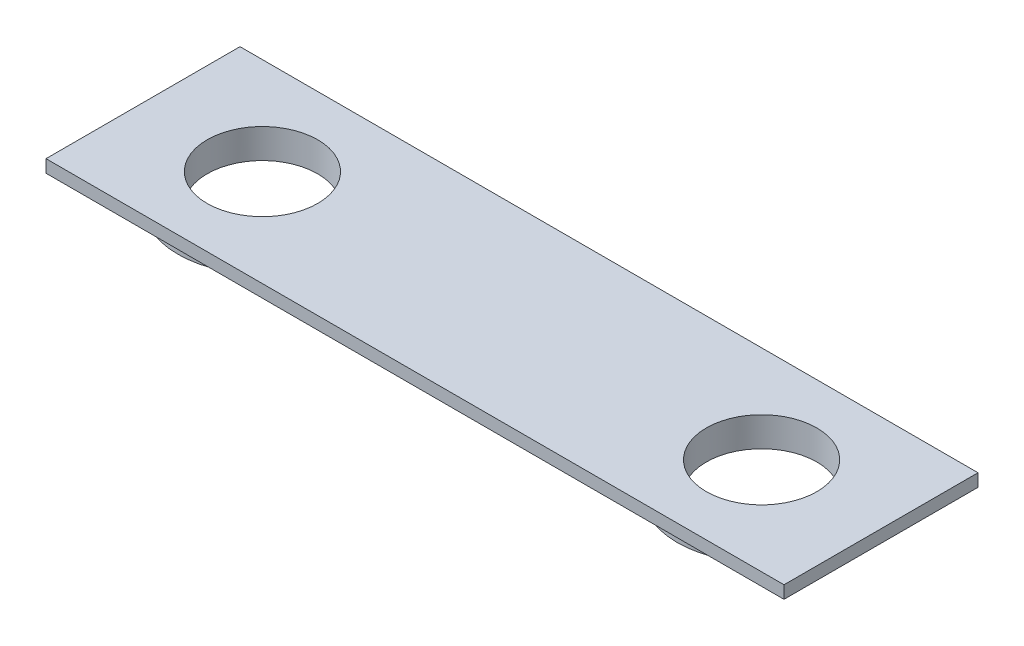
ISO-10303-21;
HEADER;
FILE_DESCRIPTION(('STEP AP214'),'2;1');
FILE_NAME('part.step','',(''),(''),'','','');
FILE_SCHEMA(('AUTOMOTIVE_DESIGN { 1 0 10303 214 1 1 1 1 }'));
ENDSEC;
DATA;
#1=APPLICATION_CONTEXT('core data for automotive mechanical design processes');
#2=APPLICATION_PROTOCOL_DEFINITION('international standard','automotive_design',2000,#1);
#3=PRODUCT_CONTEXT('',#1,'mechanical');
#4=PRODUCT('Part','Part','',(#3));
#5=PRODUCT_RELATED_PRODUCT_CATEGORY('part','',(#4));
#6=PRODUCT_DEFINITION_FORMATION('','',#4);
#7=PRODUCT_DEFINITION_CONTEXT('part definition',#1,'design');
#8=PRODUCT_DEFINITION('design','',#6,#7);
#9=PRODUCT_DEFINITION_SHAPE('','',#8);
#10=(LENGTH_UNIT() NAMED_UNIT(*) SI_UNIT(.MILLI.,.METRE.));
#11=(NAMED_UNIT(*) PLANE_ANGLE_UNIT() SI_UNIT($,.RADIAN.));
#12=(NAMED_UNIT(*) SI_UNIT($,.STERADIAN.) SOLID_ANGLE_UNIT());
#13=UNCERTAINTY_MEASURE_WITH_UNIT(LENGTH_MEASURE(1.E-05),#10,'distance_accuracy_value','');
#14=(GEOMETRIC_REPRESENTATION_CONTEXT(3) GLOBAL_UNCERTAINTY_ASSIGNED_CONTEXT((#13)) GLOBAL_UNIT_ASSIGNED_CONTEXT((#10,
#11,#12)) REPRESENTATION_CONTEXT('',''));
#15=CARTESIAN_POINT('',(0.,0.,0.));
#16=DIRECTION('',(0.,0.,1.));
#17=DIRECTION('',(1.,0.,0.));
#18=AXIS2_PLACEMENT_3D('',#15,#16,#17);
#19=CARTESIAN_POINT('',(0.,0.,0.));
#20=DIRECTION('',(0.,1.,0.));
#21=DIRECTION('',(0.,0.,1.));
#22=AXIS2_PLACEMENT_3D('',#19,#20,#21);
#23=PLANE('',#22);
#24=CARTESIAN_POINT('',(-29.591,0.,0.));
#25=DIRECTION('',(0.,1.,0.));
#26=DIRECTION('',(0.,0.,1.));
#27=AXIS2_PLACEMENT_3D('',#24,#25,#26);
#28=CIRCLE('',#27,9.99999999999999);
#29=CARTESIAN_POINT('',(-29.591,0.,9.99999999999999));
#30=VERTEX_POINT('',#29);
#31=EDGE_CURVE('E52',#30,#30,#28,.F.);
#32=ORIENTED_EDGE('',*,*,#31,.F.);
#33=EDGE_LOOP('',(#32));
#34=FACE_BOUND('',#33,.T.);
#35=DIRECTION('',(0.,0.,-1.));
#36=VECTOR('',#35,1.);
#37=CARTESIAN_POINT('',(43.75,0.,-11.5));
#38=LINE('',#37,#36);
#39=CARTESIAN_POINT('',(43.75,0.,11.5));
#40=VERTEX_POINT('',#39);
#41=CARTESIAN_POINT('',(43.75,0.,-11.5));
#42=VERTEX_POINT('',#41);
#43=EDGE_CURVE('E112',#40,#42,#38,.T.);
#44=ORIENTED_EDGE('',*,*,#43,.F.);
#45=DIRECTION('',(1.,0.,0.));
#46=VECTOR('',#45,1.);
#47=CARTESIAN_POINT('',(-43.75,0.,11.5));
#48=LINE('',#47,#46);
#49=CARTESIAN_POINT('',(-43.75,0.,11.5));
#50=VERTEX_POINT('',#49);
#51=EDGE_CURVE('E83',#50,#40,#48,.T.);
#52=ORIENTED_EDGE('',*,*,#51,.F.);
#53=DIRECTION('',(0.,0.,1.));
#54=VECTOR('',#53,1.);
#55=CARTESIAN_POINT('',(-43.75,0.,-11.5));
#56=LINE('',#55,#54);
#57=CARTESIAN_POINT('',(-43.75,0.,-11.5));
#58=VERTEX_POINT('',#57);
#59=EDGE_CURVE('E77',#58,#50,#56,.T.);
#60=ORIENTED_EDGE('',*,*,#59,.F.);
#61=DIRECTION('',(-1.,0.,0.));
#62=VECTOR('',#61,1.);
#63=CARTESIAN_POINT('',(-43.75,0.,-11.5));
#64=LINE('',#63,#62);
#65=EDGE_CURVE('E102',#42,#58,#64,.T.);
#66=ORIENTED_EDGE('',*,*,#65,.F.);
#67=EDGE_LOOP('',(#44,#52,#60,#66));
#68=FACE_BOUND('',#67,.T.);
#69=CARTESIAN_POINT('',(29.591,0.,0.));
#70=DIRECTION('',(0.,1.,0.));
#71=DIRECTION('',(0.,0.,1.));
#72=AXIS2_PLACEMENT_3D('',#69,#70,#71);
#73=CIRCLE('',#72,9.99999999999999);
#74=CARTESIAN_POINT('',(29.591,0.,9.99999999999999));
#75=VERTEX_POINT('',#74);
#76=EDGE_CURVE('E11',#75,#75,#73,.F.);
#77=ORIENTED_EDGE('',*,*,#76,.F.);
#78=EDGE_LOOP('',(#77));
#79=FACE_BOUND('',#78,.T.);
#80=ADVANCED_FACE('F43',(#34,#68,#79),#23,.F.);
#81=CARTESIAN_POINT('',(0.,1.5,0.));
#82=DIRECTION('',(0.,1.,0.));
#83=DIRECTION('',(0.,0.,1.));
#84=AXIS2_PLACEMENT_3D('',#81,#82,#83);
#85=PLANE('',#84);
#86=CARTESIAN_POINT('',(-29.591,1.5,0.));
#87=DIRECTION('',(0.,1.,0.));
#88=DIRECTION('',(0.,0.,1.));
#89=AXIS2_PLACEMENT_3D('',#86,#87,#88);
#90=CIRCLE('',#89,6.55);
#91=CARTESIAN_POINT('',(-29.591,1.5,6.55));
#92=VERTEX_POINT('',#91);
#93=EDGE_CURVE('E115',#92,#92,#90,.T.);
#94=ORIENTED_EDGE('',*,*,#93,.F.);
#95=EDGE_LOOP('',(#94));
#96=FACE_BOUND('',#95,.T.);
#97=DIRECTION('',(0.,0.,-1.));
#98=VECTOR('',#97,1.);
#99=CARTESIAN_POINT('',(43.75,1.5,-11.5));
#100=LINE('',#99,#98);
#101=CARTESIAN_POINT('',(43.75,1.5,11.5));
#102=VERTEX_POINT('',#101);
#103=CARTESIAN_POINT('',(43.75,1.5,-11.5));
#104=VERTEX_POINT('',#103);
#105=EDGE_CURVE('E97',#102,#104,#100,.T.);
#106=ORIENTED_EDGE('',*,*,#105,.T.);
#107=DIRECTION('',(-1.,0.,0.));
#108=VECTOR('',#107,1.);
#109=CARTESIAN_POINT('',(-43.75,1.5,-11.5));
#110=LINE('',#109,#108);
#111=CARTESIAN_POINT('',(-43.75,1.5,-11.5));
#112=VERTEX_POINT('',#111);
#113=EDGE_CURVE('E91',#104,#112,#110,.T.);
#114=ORIENTED_EDGE('',*,*,#113,.T.);
#115=DIRECTION('',(0.,0.,1.));
#116=VECTOR('',#115,1.);
#117=CARTESIAN_POINT('',(-43.75,1.5,-11.5));
#118=LINE('',#117,#116);
#119=CARTESIAN_POINT('',(-43.75,1.5,11.5));
#120=VERTEX_POINT('',#119);
#121=EDGE_CURVE('E95',#112,#120,#118,.T.);
#122=ORIENTED_EDGE('',*,*,#121,.T.);
#123=DIRECTION('',(1.,0.,0.));
#124=VECTOR('',#123,1.);
#125=CARTESIAN_POINT('',(-43.75,1.5,11.5));
#126=LINE('',#125,#124);
#127=EDGE_CURVE('E60',#120,#102,#126,.T.);
#128=ORIENTED_EDGE('',*,*,#127,.T.);
#129=EDGE_LOOP('',(#106,#114,#122,#128));
#130=FACE_BOUND('',#129,.T.);
#131=CARTESIAN_POINT('',(29.591,1.5,0.));
#132=DIRECTION('',(0.,1.,0.));
#133=DIRECTION('',(0.,0.,1.));
#134=AXIS2_PLACEMENT_3D('',#131,#132,#133);
#135=CIRCLE('',#134,6.54999999999998);
#136=CARTESIAN_POINT('',(29.591,1.5,6.54999999999998));
#137=VERTEX_POINT('',#136);
#138=EDGE_CURVE('E177',#137,#137,#135,.T.);
#139=ORIENTED_EDGE('',*,*,#138,.F.);
#140=EDGE_LOOP('',(#139));
#141=FACE_BOUND('',#140,.T.);
#142=ADVANCED_FACE('F92',(#96,#130,#141),#85,.T.);
#143=CARTESIAN_POINT('',(43.75,1.5,-11.5));
#144=DIRECTION('',(-1.,0.,0.));
#145=DIRECTION('',(0.,0.,1.));
#146=AXIS2_PLACEMENT_3D('',#143,#144,#145);
#147=PLANE('',#146);
#148=ORIENTED_EDGE('',*,*,#43,.T.);
#149=DIRECTION('',(0.,-1.,0.));
#150=VECTOR('',#149,1.);
#151=CARTESIAN_POINT('',(43.75,1.5,-11.5));
#152=LINE('',#151,#150);
#153=EDGE_CURVE('E103',#104,#42,#152,.T.);
#154=ORIENTED_EDGE('',*,*,#153,.F.);
#155=ORIENTED_EDGE('',*,*,#105,.F.);
#156=DIRECTION('',(0.,-1.,0.));
#157=VECTOR('',#156,1.);
#158=CARTESIAN_POINT('',(43.75,1.5,11.5));
#159=LINE('',#158,#157);
#160=EDGE_CURVE('E108',#102,#40,#159,.T.);
#161=ORIENTED_EDGE('',*,*,#160,.T.);
#162=EDGE_LOOP('',(#148,#154,#155,#161));
#163=FACE_BOUND('',#162,.T.);
#164=ADVANCED_FACE('F45',(#163),#147,.F.);
#165=CARTESIAN_POINT('',(-43.75,1.5,-11.5));
#166=DIRECTION('',(0.,0.,1.));
#167=DIRECTION('',(1.,0.,0.));
#168=AXIS2_PLACEMENT_3D('',#165,#166,#167);
#169=PLANE('',#168);
#170=ORIENTED_EDGE('',*,*,#65,.T.);
#171=DIRECTION('',(0.,-1.,0.));
#172=VECTOR('',#171,1.);
#173=CARTESIAN_POINT('',(-43.75,1.5,-11.5));
#174=LINE('',#173,#172);
#175=EDGE_CURVE('E100',#112,#58,#174,.T.);
#176=ORIENTED_EDGE('',*,*,#175,.F.);
#177=ORIENTED_EDGE('',*,*,#113,.F.);
#178=ORIENTED_EDGE('',*,*,#153,.T.);
#179=EDGE_LOOP('',(#170,#176,#177,#178));
#180=FACE_BOUND('',#179,.T.);
#181=ADVANCED_FACE('F101',(#180),#169,.F.);
#182=CARTESIAN_POINT('',(-43.75,1.5,-11.5));
#183=DIRECTION('',(1.,0.,0.));
#184=DIRECTION('',(0.,0.,-1.));
#185=AXIS2_PLACEMENT_3D('',#182,#183,#184);
#186=PLANE('',#185);
#187=ORIENTED_EDGE('',*,*,#59,.T.);
#188=DIRECTION('',(0.,-1.,0.));
#189=VECTOR('',#188,1.);
#190=CARTESIAN_POINT('',(-43.75,1.5,11.5));
#191=LINE('',#190,#189);
#192=EDGE_CURVE('E104',#120,#50,#191,.T.);
#193=ORIENTED_EDGE('',*,*,#192,.F.);
#194=ORIENTED_EDGE('',*,*,#121,.F.);
#195=ORIENTED_EDGE('',*,*,#175,.T.);
#196=EDGE_LOOP('',(#187,#193,#194,#195));
#197=FACE_BOUND('',#196,.T.);
#198=ADVANCED_FACE('F106',(#197),#186,.F.);
#199=CARTESIAN_POINT('',(-43.75,1.5,11.5));
#200=DIRECTION('',(0.,0.,-1.));
#201=DIRECTION('',(-1.,0.,0.));
#202=AXIS2_PLACEMENT_3D('',#199,#200,#201);
#203=PLANE('',#202);
#204=ORIENTED_EDGE('',*,*,#51,.T.);
#205=ORIENTED_EDGE('',*,*,#160,.F.);
#206=ORIENTED_EDGE('',*,*,#127,.F.);
#207=ORIENTED_EDGE('',*,*,#192,.T.);
#208=EDGE_LOOP('',(#204,#205,#206,#207));
#209=FACE_BOUND('',#208,.T.);
#210=ADVANCED_FACE('F159',(#209),#203,.F.);
#211=CARTESIAN_POINT('',(-29.591,1.5,0.));
#212=DIRECTION('',(0.,-1.,0.));
#213=DIRECTION('',(0.,0.,-1.));
#214=AXIS2_PLACEMENT_3D('',#211,#212,#213);
#215=CYLINDRICAL_SURFACE('',#214,6.55);
#216=ORIENTED_EDGE('',*,*,#93,.T.);
#217=EDGE_LOOP('',(#216));
#218=FACE_BOUND('',#217,.T.);
#219=CARTESIAN_POINT('',(-29.591,-2.,0.));
#220=DIRECTION('',(0.,-1.,0.));
#221=DIRECTION('',(0.,0.,-1.));
#222=AXIS2_PLACEMENT_3D('',#219,#220,#221);
#223=CIRCLE('',#222,6.55);
#224=CARTESIAN_POINT('',(-29.591,-2.,-6.55));
#225=VERTEX_POINT('',#224);
#226=EDGE_CURVE('E183',#225,#225,#223,.T.);
#227=ORIENTED_EDGE('',*,*,#226,.T.);
#228=EDGE_LOOP('',(#227));
#229=FACE_BOUND('',#228,.T.);
#230=ADVANCED_FACE('F155',(#218,#229),#215,.F.);
#231=CARTESIAN_POINT('',(29.591,1.5,0.));
#232=DIRECTION('',(0.,-1.,0.));
#233=DIRECTION('',(0.,0.,-1.));
#234=AXIS2_PLACEMENT_3D('',#231,#232,#233);
#235=CYLINDRICAL_SURFACE('',#234,6.54999999999998);
#236=ORIENTED_EDGE('',*,*,#138,.T.);
#237=EDGE_LOOP('',(#236));
#238=FACE_BOUND('',#237,.T.);
#239=CARTESIAN_POINT('',(29.591,-2.,0.));
#240=DIRECTION('',(0.,-1.,0.));
#241=DIRECTION('',(0.,0.,-1.));
#242=AXIS2_PLACEMENT_3D('',#239,#240,#241);
#243=CIRCLE('',#242,6.54999999999999);
#244=CARTESIAN_POINT('',(29.591,-2.,-6.54999999999999));
#245=VERTEX_POINT('',#244);
#246=EDGE_CURVE('E186',#245,#245,#243,.T.);
#247=ORIENTED_EDGE('',*,*,#246,.T.);
#248=EDGE_LOOP('',(#247));
#249=FACE_BOUND('',#248,.T.);
#250=ADVANCED_FACE('F148',(#238,#249),#235,.F.);
#251=CARTESIAN_POINT('',(-29.591,-2.,0.));
#252=DIRECTION('',(0.,-1.,0.));
#253=DIRECTION('',(0.,0.,-1.));
#254=AXIS2_PLACEMENT_3D('',#251,#252,#253);
#255=PLANE('',#254);
#256=CARTESIAN_POINT('',(-29.591,-2.,0.));
#257=DIRECTION('',(0.,-1.,0.));
#258=DIRECTION('',(0.,0.,-1.));
#259=AXIS2_PLACEMENT_3D('',#256,#257,#258);
#260=CIRCLE('',#259,9.99999999999999);
#261=CARTESIAN_POINT('',(-29.591,-2.,-9.99999999999999));
#262=VERTEX_POINT('',#261);
#263=EDGE_CURVE('E180',#262,#262,#260,.T.);
#264=ORIENTED_EDGE('',*,*,#263,.T.);
#265=EDGE_LOOP('',(#264));
#266=FACE_BOUND('',#265,.T.);
#267=ORIENTED_EDGE('',*,*,#226,.F.);
#268=EDGE_LOOP('',(#267));
#269=FACE_BOUND('',#268,.T.);
#270=ADVANCED_FACE('F145',(#266,#269),#255,.T.);
#271=CARTESIAN_POINT('',(-29.591,-2.,0.));
#272=DIRECTION('',(0.,1.,0.));
#273=DIRECTION('',(0.,0.,1.));
#274=AXIS2_PLACEMENT_3D('',#271,#272,#273);
#275=CYLINDRICAL_SURFACE('',#274,9.99999999999999);
#276=ORIENTED_EDGE('',*,*,#263,.F.);
#277=EDGE_LOOP('',(#276));
#278=FACE_BOUND('',#277,.T.);
#279=ORIENTED_EDGE('',*,*,#31,.T.);
#280=EDGE_LOOP('',(#279));
#281=FACE_BOUND('',#280,.T.);
#282=ADVANCED_FACE('F124',(#278,#281),#275,.T.);
#283=CARTESIAN_POINT('',(29.591,-2.,0.));
#284=DIRECTION('',(0.,-1.,0.));
#285=DIRECTION('',(0.,0.,-1.));
#286=AXIS2_PLACEMENT_3D('',#283,#284,#285);
#287=PLANE('',#286);
#288=CARTESIAN_POINT('',(29.591,-2.,0.));
#289=DIRECTION('',(0.,-1.,0.));
#290=DIRECTION('',(0.,0.,-1.));
#291=AXIS2_PLACEMENT_3D('',#288,#289,#290);
#292=CIRCLE('',#291,9.99999999999999);
#293=CARTESIAN_POINT('',(29.591,-2.,-9.99999999999999));
#294=VERTEX_POINT('',#293);
#295=EDGE_CURVE('E189',#294,#294,#292,.T.);
#296=ORIENTED_EDGE('',*,*,#295,.T.);
#297=EDGE_LOOP('',(#296));
#298=FACE_BOUND('',#297,.T.);
#299=ORIENTED_EDGE('',*,*,#246,.F.);
#300=EDGE_LOOP('',(#299));
#301=FACE_BOUND('',#300,.T.);
#302=ADVANCED_FACE('F135',(#298,#301),#287,.T.);
#303=CARTESIAN_POINT('',(29.591,-2.,0.));
#304=DIRECTION('',(0.,1.,0.));
#305=DIRECTION('',(0.,0.,1.));
#306=AXIS2_PLACEMENT_3D('',#303,#304,#305);
#307=CYLINDRICAL_SURFACE('',#306,9.99999999999999);
#308=ORIENTED_EDGE('',*,*,#295,.F.);
#309=EDGE_LOOP('',(#308));
#310=FACE_BOUND('',#309,.T.);
#311=ORIENTED_EDGE('',*,*,#76,.T.);
#312=EDGE_LOOP('',(#311));
#313=FACE_BOUND('',#312,.T.);
#314=ADVANCED_FACE('F133',(#310,#313),#307,.T.);
#315=CLOSED_SHELL('',(#80,#142,#164,#181,#198,#210,#230,#250,#270,#282,#302,#314));
#316=MANIFOLD_SOLID_BREP('B2',#315);
#317=ADVANCED_BREP_SHAPE_REPRESENTATION('',(#18,#316),#14);
#318=SHAPE_DEFINITION_REPRESENTATION(#9,#317);
ENDSEC;
END-ISO-10303-21;
